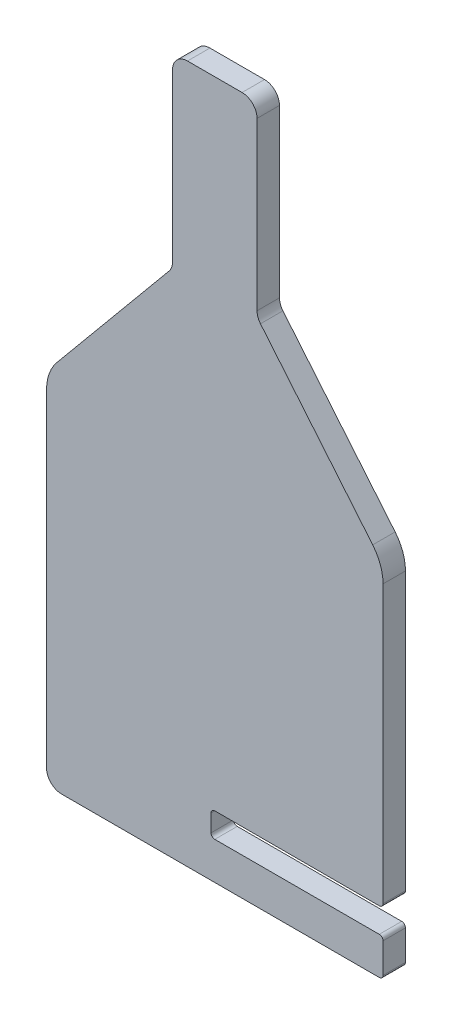
ISO-10303-21;
HEADER;
FILE_DESCRIPTION(('STEP AP214'),'2;1');
FILE_NAME('part.step','',(''),(''),'','','');
FILE_SCHEMA(('AUTOMOTIVE_DESIGN { 1 0 10303 214 1 1 1 1 }'));
ENDSEC;
DATA;
#1=APPLICATION_CONTEXT('core data for automotive mechanical design processes');
#2=APPLICATION_PROTOCOL_DEFINITION('international standard','automotive_design',2000,#1);
#3=PRODUCT_CONTEXT('',#1,'mechanical');
#4=PRODUCT('Part','Part','',(#3));
#5=PRODUCT_RELATED_PRODUCT_CATEGORY('part','',(#4));
#6=PRODUCT_DEFINITION_FORMATION('','',#4);
#7=PRODUCT_DEFINITION_CONTEXT('part definition',#1,'design');
#8=PRODUCT_DEFINITION('design','',#6,#7);
#9=PRODUCT_DEFINITION_SHAPE('','',#8);
#10=(LENGTH_UNIT() NAMED_UNIT(*) SI_UNIT(.MILLI.,.METRE.));
#11=(NAMED_UNIT(*) PLANE_ANGLE_UNIT() SI_UNIT($,.RADIAN.));
#12=(NAMED_UNIT(*) SI_UNIT($,.STERADIAN.) SOLID_ANGLE_UNIT());
#13=UNCERTAINTY_MEASURE_WITH_UNIT(LENGTH_MEASURE(1.E-05),#10,'distance_accuracy_value','');
#14=(GEOMETRIC_REPRESENTATION_CONTEXT(3) GLOBAL_UNCERTAINTY_ASSIGNED_CONTEXT((#13)) GLOBAL_UNIT_ASSIGNED_CONTEXT((#10,
#11,#12)) REPRESENTATION_CONTEXT('',''));
#15=CARTESIAN_POINT('',(0.,0.,0.));
#16=DIRECTION('',(0.,0.,1.));
#17=DIRECTION('',(1.,0.,0.));
#18=AXIS2_PLACEMENT_3D('',#15,#16,#17);
#19=CARTESIAN_POINT('',(22.5,-0.323324039142814,3.));
#20=DIRECTION('',(1.,0.,0.));
#21=DIRECTION('',(0.,1.,0.));
#22=AXIS2_PLACEMENT_3D('',#19,#20,#21);
#23=PLANE('',#22);
#24=DIRECTION('',(0.,-1.,0.));
#25=VECTOR('',#24,1.);
#26=CARTESIAN_POINT('',(22.5,-0.323324039142814,3.));
#27=LINE('',#26,#25);
#28=CARTESIAN_POINT('',(22.5,-2.48720248761186,3.));
#29=VERTEX_POINT('',#28);
#30=CARTESIAN_POINT('',(22.5,-39.5233240391428,3.));
#31=VERTEX_POINT('',#30);
#32=EDGE_CURVE('E376',#29,#31,#27,.T.);
#33=ORIENTED_EDGE('',*,*,#32,.T.);
#34=DIRECTION('',(0.,0.,1.));
#35=VECTOR('',#34,1.);
#36=CARTESIAN_POINT('',(22.5,-39.5233240391428,0.));
#37=LINE('',#36,#35);
#38=CARTESIAN_POINT('',(22.5,-39.5233240391428,0.));
#39=VERTEX_POINT('',#38);
#40=EDGE_CURVE('E325',#31,#39,#37,.F.);
#41=ORIENTED_EDGE('',*,*,#40,.T.);
#42=DIRECTION('',(0.,-1.,0.));
#43=VECTOR('',#42,1.);
#44=CARTESIAN_POINT('',(22.5,-0.323324039142814,0.));
#45=LINE('',#44,#43);
#46=CARTESIAN_POINT('',(22.5,-2.48720248761186,0.));
#47=VERTEX_POINT('',#46);
#48=EDGE_CURVE('E223',#47,#39,#45,.T.);
#49=ORIENTED_EDGE('',*,*,#48,.F.);
#50=DIRECTION('',(0.,0.,-1.));
#51=VECTOR('',#50,1.);
#52=CARTESIAN_POINT('',(22.5,-2.48720248761186,3.));
#53=LINE('',#52,#51);
#54=EDGE_CURVE('E291',#47,#29,#53,.F.);
#55=ORIENTED_EDGE('',*,*,#54,.T.);
#56=EDGE_LOOP('',(#33,#41,#49,#55));
#57=FACE_BOUND('',#56,.T.);
#58=ADVANCED_FACE('F37',(#57),#23,.T.);
#59=CARTESIAN_POINT('',(-5.65,45.,3.));
#60=DIRECTION('',(0.,1.,0.));
#61=DIRECTION('',(0.,0.,1.));
#62=AXIS2_PLACEMENT_3D('',#59,#60,#61);
#63=PLANE('',#62);
#64=DIRECTION('',(1.,0.,0.));
#65=VECTOR('',#64,1.);
#66=CARTESIAN_POINT('',(-5.65,45.,0.));
#67=LINE('',#66,#65);
#68=CARTESIAN_POINT('',(-3.65,45.,0.));
#69=VERTEX_POINT('',#68);
#70=CARTESIAN_POINT('',(3.65,45.,0.));
#71=VERTEX_POINT('',#70);
#72=EDGE_CURVE('E357',#69,#71,#67,.T.);
#73=ORIENTED_EDGE('',*,*,#72,.F.);
#74=DIRECTION('',(0.,0.,-1.));
#75=VECTOR('',#74,1.);
#76=CARTESIAN_POINT('',(-3.65,45.,3.));
#77=LINE('',#76,#75);
#78=CARTESIAN_POINT('',(-3.65,45.,3.));
#79=VERTEX_POINT('',#78);
#80=EDGE_CURVE('E258',#69,#79,#77,.F.);
#81=ORIENTED_EDGE('',*,*,#80,.T.);
#82=DIRECTION('',(1.,0.,0.));
#83=VECTOR('',#82,1.);
#84=CARTESIAN_POINT('',(-5.65,45.,3.));
#85=LINE('',#84,#83);
#86=CARTESIAN_POINT('',(3.65,45.,3.));
#87=VERTEX_POINT('',#86);
#88=EDGE_CURVE('E236',#79,#87,#85,.T.);
#89=ORIENTED_EDGE('',*,*,#88,.T.);
#90=DIRECTION('',(0.,0.,-1.));
#91=VECTOR('',#90,1.);
#92=CARTESIAN_POINT('',(3.65,45.,3.));
#93=LINE('',#92,#91);
#94=EDGE_CURVE('E255',#87,#71,#93,.T.);
#95=ORIENTED_EDGE('',*,*,#94,.T.);
#96=EDGE_LOOP('',(#73,#81,#89,#95));
#97=FACE_BOUND('',#96,.T.);
#98=ADVANCED_FACE('F439',(#97),#63,.T.);
#99=CARTESIAN_POINT('',(-5.65,45.,3.));
#100=DIRECTION('',(1.,0.,0.));
#101=DIRECTION('',(0.,1.,0.));
#102=AXIS2_PLACEMENT_3D('',#99,#100,#101);
#103=PLANE('',#102);
#104=DIRECTION('',(0.,-1.,0.));
#105=VECTOR('',#104,1.);
#106=CARTESIAN_POINT('',(-5.65,45.,0.));
#107=LINE('',#106,#105);
#108=CARTESIAN_POINT('',(-5.65,43.,0.));
#109=VERTEX_POINT('',#108);
#110=CARTESIAN_POINT('',(-5.64999999999999,20.7212671763629,0.));
#111=VERTEX_POINT('',#110);
#112=EDGE_CURVE('E234',#109,#111,#107,.T.);
#113=ORIENTED_EDGE('',*,*,#112,.T.);
#114=DIRECTION('',(0.,0.,-1.));
#115=VECTOR('',#114,1.);
#116=CARTESIAN_POINT('',(-5.64999999999999,20.7212671763629,3.));
#117=LINE('',#116,#115);
#118=CARTESIAN_POINT('',(-5.64999999999999,20.7212671763629,3.));
#119=VERTEX_POINT('',#118);
#120=EDGE_CURVE('E253',#111,#119,#117,.F.);
#121=ORIENTED_EDGE('',*,*,#120,.T.);
#122=DIRECTION('',(0.,-1.,0.));
#123=VECTOR('',#122,1.);
#124=CARTESIAN_POINT('',(-5.65,45.,3.));
#125=LINE('',#124,#123);
#126=CARTESIAN_POINT('',(-5.65,43.,3.));
#127=VERTEX_POINT('',#126);
#128=EDGE_CURVE('E217',#127,#119,#125,.T.);
#129=ORIENTED_EDGE('',*,*,#128,.F.);
#130=DIRECTION('',(0.,0.,-1.));
#131=VECTOR('',#130,1.);
#132=CARTESIAN_POINT('',(-5.65,43.,0.));
#133=LINE('',#132,#131);
#134=EDGE_CURVE('E250',#127,#109,#133,.T.);
#135=ORIENTED_EDGE('',*,*,#134,.T.);
#136=EDGE_LOOP('',(#113,#121,#129,#135));
#137=FACE_BOUND('',#136,.T.);
#138=ADVANCED_FACE('F449',(#137),#103,.F.);
#139=CARTESIAN_POINT('',(-5.64999999999999,20.,3.));
#140=DIRECTION('',(0.769822880270561,-0.638257575757576,0.));
#141=DIRECTION('',(0.638257575757576,0.769822880270561,0.));
#142=AXIS2_PLACEMENT_3D('',#139,#140,#141);
#143=PLANE('',#142);
#144=DIRECTION('',(-0.638257575757576,-0.769822880270561,0.));
#145=VECTOR('',#144,1.);
#146=CARTESIAN_POINT('',(-5.64999999999999,20.,0.));
#147=LINE('',#146,#145);
#148=CARTESIAN_POINT('',(-6.11035423945887,19.4447520248477,0.));
#149=VERTEX_POINT('',#148);
#150=CARTESIAN_POINT('',(-21.1189372816234,1.34241988631403,0.));
#151=VERTEX_POINT('',#150);
#152=EDGE_CURVE('E225',#149,#151,#147,.T.);
#153=ORIENTED_EDGE('',*,*,#152,.T.);
#154=DIRECTION('',(0.,0.,-1.));
#155=VECTOR('',#154,1.);
#156=CARTESIAN_POINT('',(-21.1189372816234,1.34241988631403,3.));
#157=LINE('',#156,#155);
#158=CARTESIAN_POINT('',(-21.1189372816234,1.34241988631403,3.));
#159=VERTEX_POINT('',#158);
#160=EDGE_CURVE('E282',#151,#159,#157,.F.);
#161=ORIENTED_EDGE('',*,*,#160,.T.);
#162=DIRECTION('',(-0.638257575757576,-0.769822880270561,0.));
#163=VECTOR('',#162,1.);
#164=CARTESIAN_POINT('',(-5.64999999999999,20.,3.));
#165=LINE('',#164,#163);
#166=CARTESIAN_POINT('',(-6.11035423945887,19.4447520248477,3.));
#167=VERTEX_POINT('',#166);
#168=EDGE_CURVE('E381',#167,#159,#165,.T.);
#169=ORIENTED_EDGE('',*,*,#168,.F.);
#170=DIRECTION('',(0.,0.,-1.));
#171=VECTOR('',#170,1.);
#172=CARTESIAN_POINT('',(-6.11035423945887,19.4447520248477,0.));
#173=LINE('',#172,#171);
#174=EDGE_CURVE('E247',#167,#149,#173,.T.);
#175=ORIENTED_EDGE('',*,*,#174,.T.);
#176=EDGE_LOOP('',(#153,#161,#169,#175));
#177=FACE_BOUND('',#176,.T.);
#178=ADVANCED_FACE('F458',(#177),#143,.F.);
#179=CARTESIAN_POINT('',(-22.5,-0.323324039142809,3.));
#180=DIRECTION('',(1.,0.,0.));
#181=DIRECTION('',(0.,1.,0.));
#182=AXIS2_PLACEMENT_3D('',#179,#180,#181);
#183=PLANE('',#182);
#184=DIRECTION('',(0.,-1.,0.));
#185=VECTOR('',#184,1.);
#186=CARTESIAN_POINT('',(-22.5,-0.323324039142809,3.));
#187=LINE('',#186,#185);
#188=CARTESIAN_POINT('',(-22.5,-2.48712556823143,3.));
#189=VERTEX_POINT('',#188);
#190=CARTESIAN_POINT('',(-22.5,-46.3233240391428,3.));
#191=VERTEX_POINT('',#190);
#192=EDGE_CURVE('E379',#189,#191,#187,.T.);
#193=ORIENTED_EDGE('',*,*,#192,.F.);
#194=DIRECTION('',(0.,0.,-1.));
#195=VECTOR('',#194,1.);
#196=CARTESIAN_POINT('',(-22.5,-2.48712556823143,3.));
#197=LINE('',#196,#195);
#198=CARTESIAN_POINT('',(-22.5,-2.48712556823143,0.));
#199=VERTEX_POINT('',#198);
#200=EDGE_CURVE('E275',#189,#199,#197,.T.);
#201=ORIENTED_EDGE('',*,*,#200,.T.);
#202=DIRECTION('',(0.,-1.,0.));
#203=VECTOR('',#202,1.);
#204=CARTESIAN_POINT('',(-22.5,-0.323324039142809,0.));
#205=LINE('',#204,#203);
#206=CARTESIAN_POINT('',(-22.5,-46.3233240391428,0.));
#207=VERTEX_POINT('',#206);
#208=EDGE_CURVE('E222',#199,#207,#205,.T.);
#209=ORIENTED_EDGE('',*,*,#208,.T.);
#210=DIRECTION('',(0.,0.,-1.));
#211=VECTOR('',#210,1.);
#212=CARTESIAN_POINT('',(-22.5,-46.3233240391428,3.));
#213=LINE('',#212,#211);
#214=EDGE_CURVE('E207',#207,#191,#213,.F.);
#215=ORIENTED_EDGE('',*,*,#214,.T.);
#216=EDGE_LOOP('',(#193,#201,#209,#215));
#217=FACE_BOUND('',#216,.T.);
#218=ADVANCED_FACE('F466',(#217),#183,.F.);
#219=CARTESIAN_POINT('',(-22.5,-48.3233240391428,3.));
#220=DIRECTION('',(0.,1.,0.));
#221=DIRECTION('',(0.,0.,1.));
#222=AXIS2_PLACEMENT_3D('',#219,#220,#221);
#223=PLANE('',#222);
#224=DIRECTION('',(1.,0.,0.));
#225=VECTOR('',#224,1.);
#226=CARTESIAN_POINT('',(-22.5,-48.3233240391428,0.));
#227=LINE('',#226,#225);
#228=CARTESIAN_POINT('',(-20.5,-48.3233240391428,0.));
#229=VERTEX_POINT('',#228);
#230=CARTESIAN_POINT('',(22.,-48.3233240391428,0.));
#231=VERTEX_POINT('',#230);
#232=EDGE_CURVE('E214',#229,#231,#227,.T.);
#233=ORIENTED_EDGE('',*,*,#232,.T.);
#234=DIRECTION('',(0.,0.,-1.));
#235=VECTOR('',#234,1.);
#236=CARTESIAN_POINT('',(22.,-48.3233240391428,3.));
#237=LINE('',#236,#235);
#238=CARTESIAN_POINT('',(22.,-48.3233240391428,3.));
#239=VERTEX_POINT('',#238);
#240=EDGE_CURVE('E60',#231,#239,#237,.F.);
#241=ORIENTED_EDGE('',*,*,#240,.T.);
#242=DIRECTION('',(1.,0.,0.));
#243=VECTOR('',#242,1.);
#244=CARTESIAN_POINT('',(-22.5,-48.3233240391428,3.));
#245=LINE('',#244,#243);
#246=CARTESIAN_POINT('',(-20.5,-48.3233240391428,3.));
#247=VERTEX_POINT('',#246);
#248=EDGE_CURVE('E215',#247,#239,#245,.T.);
#249=ORIENTED_EDGE('',*,*,#248,.F.);
#250=DIRECTION('',(0.,0.,-1.));
#251=VECTOR('',#250,1.);
#252=CARTESIAN_POINT('',(-20.5,-48.3233240391428,3.));
#253=LINE('',#252,#251);
#254=EDGE_CURVE('E205',#247,#229,#253,.T.);
#255=ORIENTED_EDGE('',*,*,#254,.T.);
#256=EDGE_LOOP('',(#233,#241,#249,#255));
#257=FACE_BOUND('',#256,.T.);
#258=ADVANCED_FACE('F213',(#257),#223,.F.);
#259=CARTESIAN_POINT('',(22.5,-43.8233240391428,3.));
#260=VERTEX_POINT('',#259);
#261=CARTESIAN_POINT('',(22.5,-47.8233240391428,3.));
#262=VERTEX_POINT('',#261);
#263=EDGE_CURVE('E375',#260,#262,#27,.T.);
#264=ORIENTED_EDGE('',*,*,#263,.T.);
#265=DIRECTION('',(0.,0.,-1.));
#266=VECTOR('',#265,1.);
#267=CARTESIAN_POINT('',(22.5,-47.8233240391428,0.));
#268=LINE('',#267,#266);
#269=CARTESIAN_POINT('',(22.5,-47.8233240391428,0.));
#270=VERTEX_POINT('',#269);
#271=EDGE_CURVE('E311',#262,#270,#268,.T.);
#272=ORIENTED_EDGE('',*,*,#271,.T.);
#273=CARTESIAN_POINT('',(22.5,-43.8233240391428,0.));
#274=VERTEX_POINT('',#273);
#275=EDGE_CURVE('E228',#274,#270,#45,.T.);
#276=ORIENTED_EDGE('',*,*,#275,.F.);
#277=DIRECTION('',(0.,0.,1.));
#278=VECTOR('',#277,1.);
#279=CARTESIAN_POINT('',(22.5,-43.8233240391428,3.));
#280=LINE('',#279,#278);
#281=EDGE_CURVE('E308',#274,#260,#280,.T.);
#282=ORIENTED_EDGE('',*,*,#281,.T.);
#283=EDGE_LOOP('',(#264,#272,#276,#282));
#284=FACE_BOUND('',#283,.T.);
#285=ADVANCED_FACE('F394',(#284),#23,.T.);
#286=CARTESIAN_POINT('',(5.65000000000001,19.9990615554433,3.));
#287=DIRECTION('',(0.769808398739628,0.638275041992032,0.));
#288=DIRECTION('',(-0.638275041992032,0.769808398739628,0.));
#289=AXIS2_PLACEMENT_3D('',#286,#287,#288);
#290=PLANE('',#289);
#291=DIRECTION('',(0.638275041992032,-0.769808398739628,0.));
#292=VECTOR('',#291,1.);
#293=CARTESIAN_POINT('',(5.65000000000001,19.9990615554433,3.));
#294=LINE('',#293,#292);
#295=CARTESIAN_POINT('',(6.11038320252075,19.4438042876156,3.));
#296=VERTEX_POINT('',#295);
#297=CARTESIAN_POINT('',(21.1188503924378,1.34244776434033,3.));
#298=VERTEX_POINT('',#297);
#299=EDGE_CURVE('E372',#296,#298,#294,.T.);
#300=ORIENTED_EDGE('',*,*,#299,.T.);
#301=DIRECTION('',(0.,0.,-1.));
#302=VECTOR('',#301,1.);
#303=CARTESIAN_POINT('',(21.1188503924378,1.34244776434033,3.));
#304=LINE('',#303,#302);
#305=CARTESIAN_POINT('',(21.1188503924378,1.34244776434033,0.));
#306=VERTEX_POINT('',#305);
#307=EDGE_CURVE('E288',#298,#306,#304,.T.);
#308=ORIENTED_EDGE('',*,*,#307,.T.);
#309=DIRECTION('',(0.638275041992032,-0.769808398739628,0.));
#310=VECTOR('',#309,1.);
#311=CARTESIAN_POINT('',(5.65000000000001,19.9990615554433,0.));
#312=LINE('',#311,#310);
#313=CARTESIAN_POINT('',(6.11038320252075,19.4438042876156,0.));
#314=VERTEX_POINT('',#313);
#315=EDGE_CURVE('E387',#314,#306,#312,.T.);
#316=ORIENTED_EDGE('',*,*,#315,.F.);
#317=DIRECTION('',(0.,0.,-1.));
#318=VECTOR('',#317,1.);
#319=CARTESIAN_POINT('',(6.11038320252075,19.4438042876156,3.));
#320=LINE('',#319,#318);
#321=EDGE_CURVE('E265',#314,#296,#320,.F.);
#322=ORIENTED_EDGE('',*,*,#321,.T.);
#323=EDGE_LOOP('',(#300,#308,#316,#322));
#324=FACE_BOUND('',#323,.T.);
#325=ADVANCED_FACE('F421',(#324),#290,.T.);
#326=CARTESIAN_POINT('',(5.65,45.,3.));
#327=DIRECTION('',(1.,0.,0.));
#328=DIRECTION('',(0.,1.,0.));
#329=AXIS2_PLACEMENT_3D('',#326,#327,#328);
#330=PLANE('',#329);
#331=DIRECTION('',(0.,-1.,0.));
#332=VECTOR('',#331,1.);
#333=CARTESIAN_POINT('',(5.65,45.,3.));
#334=LINE('',#333,#332);
#335=CARTESIAN_POINT('',(5.65,43.,3.));
#336=VERTEX_POINT('',#335);
#337=CARTESIAN_POINT('',(5.65000000000001,20.7203543715997,3.));
#338=VERTEX_POINT('',#337);
#339=EDGE_CURVE('E369',#336,#338,#334,.T.);
#340=ORIENTED_EDGE('',*,*,#339,.T.);
#341=DIRECTION('',(0.,0.,-1.));
#342=VECTOR('',#341,1.);
#343=CARTESIAN_POINT('',(5.65000000000001,20.7203543715997,0.));
#344=LINE('',#343,#342);
#345=CARTESIAN_POINT('',(5.65000000000001,20.7203543715997,0.));
#346=VERTEX_POINT('',#345);
#347=EDGE_CURVE('E262',#338,#346,#344,.T.);
#348=ORIENTED_EDGE('',*,*,#347,.T.);
#349=DIRECTION('',(0.,-1.,0.));
#350=VECTOR('',#349,1.);
#351=CARTESIAN_POINT('',(5.65,45.,0.));
#352=LINE('',#351,#350);
#353=CARTESIAN_POINT('',(5.65,43.,0.));
#354=VERTEX_POINT('',#353);
#355=EDGE_CURVE('E360',#354,#346,#352,.T.);
#356=ORIENTED_EDGE('',*,*,#355,.F.);
#357=DIRECTION('',(0.,0.,-1.));
#358=VECTOR('',#357,1.);
#359=CARTESIAN_POINT('',(5.65,43.,3.));
#360=LINE('',#359,#358);
#361=EDGE_CURVE('E260',#354,#336,#360,.F.);
#362=ORIENTED_EDGE('',*,*,#361,.T.);
#363=EDGE_LOOP('',(#340,#348,#356,#362));
#364=FACE_BOUND('',#363,.T.);
#365=ADVANCED_FACE('F431',(#364),#330,.T.);
#366=CARTESIAN_POINT('',(0.,0.,3.));
#367=DIRECTION('',(0.,0.,-1.));
#368=DIRECTION('',(-1.,0.,0.));
#369=AXIS2_PLACEMENT_3D('',#366,#367,#368);
#370=PLANE('',#369);
#371=ORIENTED_EDGE('',*,*,#248,.T.);
#372=CARTESIAN_POINT('',(22.,-47.8233240391428,3.));
#373=DIRECTION('',(0.,0.,-1.));
#374=DIRECTION('',(-1.,0.,0.));
#375=AXIS2_PLACEMENT_3D('',#372,#373,#374);
#376=CIRCLE('',#375,0.5);
#377=EDGE_CURVE('E323',#239,#262,#376,.F.);
#378=ORIENTED_EDGE('',*,*,#377,.T.);
#379=ORIENTED_EDGE('',*,*,#263,.F.);
#380=CARTESIAN_POINT('',(22.,-43.8233240391428,3.));
#381=DIRECTION('',(0.,0.,-1.));
#382=DIRECTION('',(-1.,0.,0.));
#383=AXIS2_PLACEMENT_3D('',#380,#381,#382);
#384=CIRCLE('',#383,0.5);
#385=CARTESIAN_POINT('',(22.,-43.3233240391428,3.));
#386=VERTEX_POINT('',#385);
#387=EDGE_CURVE('E321',#260,#386,#384,.F.);
#388=ORIENTED_EDGE('',*,*,#387,.T.);
#389=DIRECTION('',(1.,0.,0.));
#390=VECTOR('',#389,1.);
#391=CARTESIAN_POINT('',(22.5,-43.3233240391428,3.));
#392=LINE('',#391,#390);
#393=CARTESIAN_POINT('',(0.,-43.3233240391428,3.));
#394=VERTEX_POINT('',#393);
#395=EDGE_CURVE('E336',#394,#386,#392,.T.);
#396=ORIENTED_EDGE('',*,*,#395,.F.);
#397=CARTESIAN_POINT('',(0.,-42.8233240391428,3.));
#398=DIRECTION('',(0.,0.,-1.));
#399=DIRECTION('',(-1.,0.,0.));
#400=AXIS2_PLACEMENT_3D('',#397,#398,#399);
#401=CIRCLE('',#400,0.5);
#402=CARTESIAN_POINT('',(-0.500000000000001,-42.8233240391428,3.));
#403=VERTEX_POINT('',#402);
#404=EDGE_CURVE('E45',#394,#403,#401,.T.);
#405=ORIENTED_EDGE('',*,*,#404,.T.);
#406=DIRECTION('',(0.,-1.,0.));
#407=VECTOR('',#406,1.);
#408=CARTESIAN_POINT('',(-0.500000000000001,-40.0233240391428,3.));
#409=LINE('',#408,#407);
#410=CARTESIAN_POINT('',(-0.500000000000001,-40.5233240391428,3.));
#411=VERTEX_POINT('',#410);
#412=EDGE_CURVE('E334',#411,#403,#409,.T.);
#413=ORIENTED_EDGE('',*,*,#412,.F.);
#414=CARTESIAN_POINT('',(0.,-40.5233240391428,3.));
#415=DIRECTION('',(0.,0.,-1.));
#416=DIRECTION('',(-1.,0.,0.));
#417=AXIS2_PLACEMENT_3D('',#414,#415,#416);
#418=CIRCLE('',#417,0.5);
#419=CARTESIAN_POINT('',(0.,-40.0233240391428,3.));
#420=VERTEX_POINT('',#419);
#421=EDGE_CURVE('E327',#411,#420,#418,.T.);
#422=ORIENTED_EDGE('',*,*,#421,.T.);
#423=DIRECTION('',(-1.,0.,0.));
#424=VECTOR('',#423,1.);
#425=CARTESIAN_POINT('',(22.5,-40.0233240391428,3.));
#426=LINE('',#425,#424);
#427=CARTESIAN_POINT('',(22.,-40.0233240391428,3.));
#428=VERTEX_POINT('',#427);
#429=EDGE_CURVE('E345',#428,#420,#426,.T.);
#430=ORIENTED_EDGE('',*,*,#429,.F.);
#431=CARTESIAN_POINT('',(22.,-39.5233240391428,3.));
#432=DIRECTION('',(0.,0.,-1.));
#433=DIRECTION('',(-1.,0.,0.));
#434=AXIS2_PLACEMENT_3D('',#431,#432,#433);
#435=CIRCLE('',#434,0.5);
#436=EDGE_CURVE('E52',#428,#31,#435,.F.);
#437=ORIENTED_EDGE('',*,*,#436,.T.);
#438=ORIENTED_EDGE('',*,*,#32,.F.);
#439=CARTESIAN_POINT('',(16.5,-2.48720248761186,3.));
#440=DIRECTION('',(0.,0.,-1.));
#441=DIRECTION('',(-1.,0.,0.));
#442=AXIS2_PLACEMENT_3D('',#439,#440,#441);
#443=CIRCLE('',#442,6.);
#444=EDGE_CURVE('E284',#29,#298,#443,.F.);
#445=ORIENTED_EDGE('',*,*,#444,.T.);
#446=ORIENTED_EDGE('',*,*,#299,.F.);
#447=CARTESIAN_POINT('',(7.65000000000001,20.7203543715997,3.));
#448=DIRECTION('',(0.,0.,-1.));
#449=DIRECTION('',(-1.,0.,0.));
#450=AXIS2_PLACEMENT_3D('',#447,#448,#449);
#451=CIRCLE('',#450,2.);
#452=EDGE_CURVE('E273',#296,#338,#451,.T.);
#453=ORIENTED_EDGE('',*,*,#452,.T.);
#454=ORIENTED_EDGE('',*,*,#339,.F.);
#455=CARTESIAN_POINT('',(3.65,43.,3.));
#456=DIRECTION('',(0.,0.,-1.));
#457=DIRECTION('',(-1.,0.,0.));
#458=AXIS2_PLACEMENT_3D('',#455,#456,#457);
#459=CIRCLE('',#458,2.);
#460=EDGE_CURVE('E241',#336,#87,#459,.F.);
#461=ORIENTED_EDGE('',*,*,#460,.T.);
#462=ORIENTED_EDGE('',*,*,#88,.F.);
#463=CARTESIAN_POINT('',(-3.65,43.,3.));
#464=DIRECTION('',(0.,0.,-1.));
#465=DIRECTION('',(-1.,0.,0.));
#466=AXIS2_PLACEMENT_3D('',#463,#464,#465);
#467=CIRCLE('',#466,2.);
#468=EDGE_CURVE('E243',#79,#127,#467,.F.);
#469=ORIENTED_EDGE('',*,*,#468,.T.);
#470=ORIENTED_EDGE('',*,*,#128,.T.);
#471=CARTESIAN_POINT('',(-7.64999999999999,20.7212671763629,3.));
#472=DIRECTION('',(0.,0.,-1.));
#473=DIRECTION('',(-1.,0.,0.));
#474=AXIS2_PLACEMENT_3D('',#471,#472,#473);
#475=CIRCLE('',#474,2.);
#476=EDGE_CURVE('E269',#119,#167,#475,.T.);
#477=ORIENTED_EDGE('',*,*,#476,.T.);
#478=ORIENTED_EDGE('',*,*,#168,.T.);
#479=CARTESIAN_POINT('',(-16.5,-2.48712556823143,3.));
#480=DIRECTION('',(0.,0.,-1.));
#481=DIRECTION('',(-1.,0.,0.));
#482=AXIS2_PLACEMENT_3D('',#479,#480,#481);
#483=CIRCLE('',#482,6.);
#484=EDGE_CURVE('E286',#159,#189,#483,.F.);
#485=ORIENTED_EDGE('',*,*,#484,.T.);
#486=ORIENTED_EDGE('',*,*,#192,.T.);
#487=CARTESIAN_POINT('',(-20.5,-46.3233240391428,3.));
#488=DIRECTION('',(0.,0.,-1.));
#489=DIRECTION('',(-1.,0.,0.));
#490=AXIS2_PLACEMENT_3D('',#487,#488,#489);
#491=CIRCLE('',#490,2.);
#492=EDGE_CURVE('E245',#191,#247,#491,.F.);
#493=ORIENTED_EDGE('',*,*,#492,.T.);
#494=EDGE_LOOP('',(#371,#378,#379,#388,#396,#405,#413,#422,#430,#437,#438,#445,#446,#453,#454,
#461,#462,#469,#470,#477,#478,#485,#486,#493));
#495=FACE_BOUND('',#494,.T.);
#496=ADVANCED_FACE('F333',(#495),#370,.F.);
#497=CARTESIAN_POINT('',(0.,0.,0.));
#498=DIRECTION('',(0.,0.,-1.));
#499=DIRECTION('',(-1.,0.,0.));
#500=AXIS2_PLACEMENT_3D('',#497,#498,#499);
#501=PLANE('',#500);
#502=ORIENTED_EDGE('',*,*,#275,.T.);
#503=CARTESIAN_POINT('',(22.,-47.8233240391428,0.));
#504=DIRECTION('',(0.,0.,-1.));
#505=DIRECTION('',(-1.,0.,0.));
#506=AXIS2_PLACEMENT_3D('',#503,#504,#505);
#507=CIRCLE('',#506,0.5);
#508=EDGE_CURVE('E221',#270,#231,#507,.T.);
#509=ORIENTED_EDGE('',*,*,#508,.T.);
#510=ORIENTED_EDGE('',*,*,#232,.F.);
#511=CARTESIAN_POINT('',(-20.5,-46.3233240391428,0.));
#512=DIRECTION('',(0.,0.,-1.));
#513=DIRECTION('',(-1.,0.,0.));
#514=AXIS2_PLACEMENT_3D('',#511,#512,#513);
#515=CIRCLE('',#514,2.);
#516=EDGE_CURVE('E201',#229,#207,#515,.T.);
#517=ORIENTED_EDGE('',*,*,#516,.T.);
#518=ORIENTED_EDGE('',*,*,#208,.F.);
#519=CARTESIAN_POINT('',(-16.5,-2.48712556823143,0.));
#520=DIRECTION('',(0.,0.,-1.));
#521=DIRECTION('',(-1.,0.,0.));
#522=AXIS2_PLACEMENT_3D('',#519,#520,#521);
#523=CIRCLE('',#522,6.);
#524=EDGE_CURVE('E280',#199,#151,#523,.T.);
#525=ORIENTED_EDGE('',*,*,#524,.T.);
#526=ORIENTED_EDGE('',*,*,#152,.F.);
#527=CARTESIAN_POINT('',(-7.64999999999999,20.7212671763629,0.));
#528=DIRECTION('',(0.,0.,-1.));
#529=DIRECTION('',(-1.,0.,0.));
#530=AXIS2_PLACEMENT_3D('',#527,#528,#529);
#531=CIRCLE('',#530,2.);
#532=EDGE_CURVE('E267',#149,#111,#531,.F.);
#533=ORIENTED_EDGE('',*,*,#532,.T.);
#534=ORIENTED_EDGE('',*,*,#112,.F.);
#535=CARTESIAN_POINT('',(-3.65,43.,0.));
#536=DIRECTION('',(0.,0.,-1.));
#537=DIRECTION('',(-1.,0.,0.));
#538=AXIS2_PLACEMENT_3D('',#535,#536,#537);
#539=CIRCLE('',#538,2.);
#540=EDGE_CURVE('E211',#109,#69,#539,.T.);
#541=ORIENTED_EDGE('',*,*,#540,.T.);
#542=ORIENTED_EDGE('',*,*,#72,.T.);
#543=CARTESIAN_POINT('',(3.65,43.,0.));
#544=DIRECTION('',(0.,0.,-1.));
#545=DIRECTION('',(-1.,0.,0.));
#546=AXIS2_PLACEMENT_3D('',#543,#544,#545);
#547=CIRCLE('',#546,2.);
#548=EDGE_CURVE('E216',#71,#354,#547,.T.);
#549=ORIENTED_EDGE('',*,*,#548,.T.);
#550=ORIENTED_EDGE('',*,*,#355,.T.);
#551=CARTESIAN_POINT('',(7.65000000000001,20.7203543715997,0.));
#552=DIRECTION('',(0.,0.,-1.));
#553=DIRECTION('',(-1.,0.,0.));
#554=AXIS2_PLACEMENT_3D('',#551,#552,#553);
#555=CIRCLE('',#554,2.);
#556=EDGE_CURVE('E271',#346,#314,#555,.F.);
#557=ORIENTED_EDGE('',*,*,#556,.T.);
#558=ORIENTED_EDGE('',*,*,#315,.T.);
#559=CARTESIAN_POINT('',(16.5,-2.48720248761186,0.));
#560=DIRECTION('',(0.,0.,-1.));
#561=DIRECTION('',(-1.,0.,0.));
#562=AXIS2_PLACEMENT_3D('',#559,#560,#561);
#563=CIRCLE('',#562,6.);
#564=EDGE_CURVE('E278',#306,#47,#563,.T.);
#565=ORIENTED_EDGE('',*,*,#564,.T.);
#566=ORIENTED_EDGE('',*,*,#48,.T.);
#567=CARTESIAN_POINT('',(22.,-39.5233240391428,0.));
#568=DIRECTION('',(0.,0.,-1.));
#569=DIRECTION('',(-1.,0.,0.));
#570=AXIS2_PLACEMENT_3D('',#567,#568,#569);
#571=CIRCLE('',#570,0.5);
#572=CARTESIAN_POINT('',(22.,-40.0233240391428,0.));
#573=VERTEX_POINT('',#572);
#574=EDGE_CURVE('E314',#39,#573,#571,.T.);
#575=ORIENTED_EDGE('',*,*,#574,.T.);
#576=DIRECTION('',(-1.,0.,0.));
#577=VECTOR('',#576,1.);
#578=CARTESIAN_POINT('',(22.5,-40.0233240391428,0.));
#579=LINE('',#578,#577);
#580=CARTESIAN_POINT('',(0.,-40.0233240391428,0.));
#581=VERTEX_POINT('',#580);
#582=EDGE_CURVE('E362',#573,#581,#579,.T.);
#583=ORIENTED_EDGE('',*,*,#582,.T.);
#584=CARTESIAN_POINT('',(0.,-40.5233240391428,0.));
#585=DIRECTION('',(0.,0.,-1.));
#586=DIRECTION('',(-1.,0.,0.));
#587=AXIS2_PLACEMENT_3D('',#584,#585,#586);
#588=CIRCLE('',#587,0.5);
#589=CARTESIAN_POINT('',(-0.500000000000001,-40.5233240391428,0.));
#590=VERTEX_POINT('',#589);
#591=EDGE_CURVE('E329',#581,#590,#588,.F.);
#592=ORIENTED_EDGE('',*,*,#591,.T.);
#593=DIRECTION('',(0.,-1.,0.));
#594=VECTOR('',#593,1.);
#595=CARTESIAN_POINT('',(-0.500000000000001,-40.0233240391428,0.));
#596=LINE('',#595,#594);
#597=CARTESIAN_POINT('',(-0.500000000000001,-42.8233240391428,0.));
#598=VERTEX_POINT('',#597);
#599=EDGE_CURVE('E353',#590,#598,#596,.T.);
#600=ORIENTED_EDGE('',*,*,#599,.T.);
#601=CARTESIAN_POINT('',(0.,-42.8233240391428,0.));
#602=DIRECTION('',(0.,0.,-1.));
#603=DIRECTION('',(-1.,0.,0.));
#604=AXIS2_PLACEMENT_3D('',#601,#602,#603);
#605=CIRCLE('',#604,0.5);
#606=CARTESIAN_POINT('',(0.,-43.3233240391428,0.));
#607=VERTEX_POINT('',#606);
#608=EDGE_CURVE('E11',#598,#607,#605,.F.);
#609=ORIENTED_EDGE('',*,*,#608,.T.);
#610=DIRECTION('',(1.,0.,0.));
#611=VECTOR('',#610,1.);
#612=CARTESIAN_POINT('',(22.5,-43.3233240391428,0.));
#613=LINE('',#612,#611);
#614=CARTESIAN_POINT('',(22.,-43.3233240391428,0.));
#615=VERTEX_POINT('',#614);
#616=EDGE_CURVE('E351',#607,#615,#613,.T.);
#617=ORIENTED_EDGE('',*,*,#616,.T.);
#618=CARTESIAN_POINT('',(22.,-43.8233240391428,0.));
#619=DIRECTION('',(0.,0.,-1.));
#620=DIRECTION('',(-1.,0.,0.));
#621=AXIS2_PLACEMENT_3D('',#618,#619,#620);
#622=CIRCLE('',#621,0.5);
#623=EDGE_CURVE('E316',#615,#274,#622,.T.);
#624=ORIENTED_EDGE('',*,*,#623,.T.);
#625=EDGE_LOOP('',(#502,#509,#510,#517,#518,#525,#526,#533,#534,#541,#542,#549,#550,#557,#558,
#565,#566,#575,#583,#592,#600,#609,#617,#624));
#626=FACE_BOUND('',#625,.T.);
#627=ADVANCED_FACE('F220',(#626),#501,.T.);
#628=CARTESIAN_POINT('',(22.5,-40.0233240391428,-23.2355331335435));
#629=DIRECTION('',(0.,1.,0.));
#630=DIRECTION('',(0.,0.,1.));
#631=AXIS2_PLACEMENT_3D('',#628,#629,#630);
#632=PLANE('',#631);
#633=ORIENTED_EDGE('',*,*,#429,.T.);
#634=DIRECTION('',(0.,0.,1.));
#635=VECTOR('',#634,1.);
#636=CARTESIAN_POINT('',(0.,-40.0233240391428,0.));
#637=LINE('',#636,#635);
#638=EDGE_CURVE('E301',#420,#581,#637,.F.);
#639=ORIENTED_EDGE('',*,*,#638,.T.);
#640=ORIENTED_EDGE('',*,*,#582,.F.);
#641=DIRECTION('',(0.,0.,1.));
#642=VECTOR('',#641,1.);
#643=CARTESIAN_POINT('',(22.,-40.0233240391428,3.));
#644=LINE('',#643,#642);
#645=EDGE_CURVE('E298',#573,#428,#644,.T.);
#646=ORIENTED_EDGE('',*,*,#645,.T.);
#647=EDGE_LOOP('',(#633,#639,#640,#646));
#648=FACE_BOUND('',#647,.T.);
#649=ADVANCED_FACE('F404',(#648),#632,.F.);
#650=CARTESIAN_POINT('',(-0.500000000000001,-40.0233240391428,-23.2355331335435));
#651=DIRECTION('',(-1.,0.,0.));
#652=DIRECTION('',(0.,-1.,0.));
#653=AXIS2_PLACEMENT_3D('',#650,#651,#652);
#654=PLANE('',#653);
#655=ORIENTED_EDGE('',*,*,#599,.F.);
#656=DIRECTION('',(0.,0.,1.));
#657=VECTOR('',#656,1.);
#658=CARTESIAN_POINT('',(-0.500000000000001,-40.5233240391428,3.));
#659=LINE('',#658,#657);
#660=EDGE_CURVE('E295',#590,#411,#659,.T.);
#661=ORIENTED_EDGE('',*,*,#660,.T.);
#662=ORIENTED_EDGE('',*,*,#412,.T.);
#663=DIRECTION('',(0.,0.,1.));
#664=VECTOR('',#663,1.);
#665=CARTESIAN_POINT('',(-0.500000000000001,-42.8233240391428,0.));
#666=LINE('',#665,#664);
#667=EDGE_CURVE('E293',#403,#598,#666,.F.);
#668=ORIENTED_EDGE('',*,*,#667,.T.);
#669=EDGE_LOOP('',(#655,#661,#662,#668));
#670=FACE_BOUND('',#669,.T.);
#671=ADVANCED_FACE('F342',(#670),#654,.F.);
#672=CARTESIAN_POINT('',(22.5,-43.3233240391428,-23.2355331335435));
#673=DIRECTION('',(0.,-1.,0.));
#674=DIRECTION('',(0.,0.,-1.));
#675=AXIS2_PLACEMENT_3D('',#672,#673,#674);
#676=PLANE('',#675);
#677=ORIENTED_EDGE('',*,*,#616,.F.);
#678=DIRECTION('',(0.,0.,1.));
#679=VECTOR('',#678,1.);
#680=CARTESIAN_POINT('',(0.,-43.3233240391428,3.));
#681=LINE('',#680,#679);
#682=EDGE_CURVE('E305',#607,#394,#681,.T.);
#683=ORIENTED_EDGE('',*,*,#682,.T.);
#684=ORIENTED_EDGE('',*,*,#395,.T.);
#685=DIRECTION('',(0.,0.,1.));
#686=VECTOR('',#685,1.);
#687=CARTESIAN_POINT('',(22.,-43.3233240391428,0.));
#688=LINE('',#687,#686);
#689=EDGE_CURVE('E303',#386,#615,#688,.F.);
#690=ORIENTED_EDGE('',*,*,#689,.T.);
#691=EDGE_LOOP('',(#677,#683,#684,#690));
#692=FACE_BOUND('',#691,.T.);
#693=ADVANCED_FACE('F355',(#692),#676,.F.);
#694=CARTESIAN_POINT('',(-20.5,-46.3233240391428,3.));
#695=DIRECTION('',(0.,0.,-1.));
#696=DIRECTION('',(-1.,0.,0.));
#697=AXIS2_PLACEMENT_3D('',#694,#695,#696);
#698=CYLINDRICAL_SURFACE('',#697,2.);
#699=ORIENTED_EDGE('',*,*,#492,.F.);
#700=ORIENTED_EDGE('',*,*,#214,.F.);
#701=ORIENTED_EDGE('',*,*,#516,.F.);
#702=ORIENTED_EDGE('',*,*,#254,.F.);
#703=EDGE_LOOP('',(#699,#700,#701,#702));
#704=FACE_BOUND('',#703,.T.);
#705=ADVANCED_FACE('F204',(#704),#698,.T.);
#706=CARTESIAN_POINT('',(-7.64999999999999,20.7212671763629,3.));
#707=DIRECTION('',(0.,0.,1.));
#708=DIRECTION('',(1.,0.,0.));
#709=AXIS2_PLACEMENT_3D('',#706,#707,#708);
#710=CYLINDRICAL_SURFACE('',#709,2.);
#711=ORIENTED_EDGE('',*,*,#476,.F.);
#712=ORIENTED_EDGE('',*,*,#120,.F.);
#713=ORIENTED_EDGE('',*,*,#532,.F.);
#714=ORIENTED_EDGE('',*,*,#174,.F.);
#715=EDGE_LOOP('',(#711,#712,#713,#714));
#716=FACE_BOUND('',#715,.T.);
#717=ADVANCED_FACE('F455',(#716),#710,.F.);
#718=CARTESIAN_POINT('',(-3.65,43.,3.));
#719=DIRECTION('',(0.,0.,1.));
#720=DIRECTION('',(1.,0.,0.));
#721=AXIS2_PLACEMENT_3D('',#718,#719,#720);
#722=CYLINDRICAL_SURFACE('',#721,2.);
#723=ORIENTED_EDGE('',*,*,#468,.F.);
#724=ORIENTED_EDGE('',*,*,#80,.F.);
#725=ORIENTED_EDGE('',*,*,#540,.F.);
#726=ORIENTED_EDGE('',*,*,#134,.F.);
#727=EDGE_LOOP('',(#723,#724,#725,#726));
#728=FACE_BOUND('',#727,.T.);
#729=ADVANCED_FACE('F446',(#728),#722,.T.);
#730=CARTESIAN_POINT('',(7.65000000000001,20.7203543715997,3.));
#731=DIRECTION('',(0.,0.,1.));
#732=DIRECTION('',(1.,0.,0.));
#733=AXIS2_PLACEMENT_3D('',#730,#731,#732);
#734=CYLINDRICAL_SURFACE('',#733,2.);
#735=ORIENTED_EDGE('',*,*,#452,.F.);
#736=ORIENTED_EDGE('',*,*,#321,.F.);
#737=ORIENTED_EDGE('',*,*,#556,.F.);
#738=ORIENTED_EDGE('',*,*,#347,.F.);
#739=EDGE_LOOP('',(#735,#736,#737,#738));
#740=FACE_BOUND('',#739,.T.);
#741=ADVANCED_FACE('F428',(#740),#734,.F.);
#742=CARTESIAN_POINT('',(3.65,43.,3.));
#743=DIRECTION('',(0.,0.,-1.));
#744=DIRECTION('',(-1.,0.,0.));
#745=AXIS2_PLACEMENT_3D('',#742,#743,#744);
#746=CYLINDRICAL_SURFACE('',#745,2.);
#747=ORIENTED_EDGE('',*,*,#460,.F.);
#748=ORIENTED_EDGE('',*,*,#361,.F.);
#749=ORIENTED_EDGE('',*,*,#548,.F.);
#750=ORIENTED_EDGE('',*,*,#94,.F.);
#751=EDGE_LOOP('',(#747,#748,#749,#750));
#752=FACE_BOUND('',#751,.T.);
#753=ADVANCED_FACE('F437',(#752),#746,.T.);
#754=CARTESIAN_POINT('',(-16.5,-2.48712556823143,3.));
#755=DIRECTION('',(0.,0.,-1.));
#756=DIRECTION('',(-1.,0.,0.));
#757=AXIS2_PLACEMENT_3D('',#754,#755,#756);
#758=CYLINDRICAL_SURFACE('',#757,6.);
#759=ORIENTED_EDGE('',*,*,#484,.F.);
#760=ORIENTED_EDGE('',*,*,#160,.F.);
#761=ORIENTED_EDGE('',*,*,#524,.F.);
#762=ORIENTED_EDGE('',*,*,#200,.F.);
#763=EDGE_LOOP('',(#759,#760,#761,#762));
#764=FACE_BOUND('',#763,.T.);
#765=ADVANCED_FACE('F464',(#764),#758,.T.);
#766=CARTESIAN_POINT('',(16.5,-2.48720248761186,3.));
#767=DIRECTION('',(0.,0.,-1.));
#768=DIRECTION('',(-1.,0.,0.));
#769=AXIS2_PLACEMENT_3D('',#766,#767,#768);
#770=CYLINDRICAL_SURFACE('',#769,6.);
#771=ORIENTED_EDGE('',*,*,#444,.F.);
#772=ORIENTED_EDGE('',*,*,#54,.F.);
#773=ORIENTED_EDGE('',*,*,#564,.F.);
#774=ORIENTED_EDGE('',*,*,#307,.F.);
#775=EDGE_LOOP('',(#771,#772,#773,#774));
#776=FACE_BOUND('',#775,.T.);
#777=ADVANCED_FACE('F419',(#776),#770,.T.);
#778=CARTESIAN_POINT('',(0.,-40.5233240391428,-23.2355331335435));
#779=DIRECTION('',(0.,0.,-1.));
#780=DIRECTION('',(-1.,0.,0.));
#781=AXIS2_PLACEMENT_3D('',#778,#779,#780);
#782=CYLINDRICAL_SURFACE('',#781,0.5);
#783=ORIENTED_EDGE('',*,*,#591,.F.);
#784=ORIENTED_EDGE('',*,*,#638,.F.);
#785=ORIENTED_EDGE('',*,*,#421,.F.);
#786=ORIENTED_EDGE('',*,*,#660,.F.);
#787=EDGE_LOOP('',(#783,#784,#785,#786));
#788=FACE_BOUND('',#787,.T.);
#789=ADVANCED_FACE('F409',(#788),#782,.F.);
#790=CARTESIAN_POINT('',(0.,-42.8233240391428,-23.2355331335435));
#791=DIRECTION('',(0.,0.,-1.));
#792=DIRECTION('',(-1.,0.,0.));
#793=AXIS2_PLACEMENT_3D('',#790,#791,#792);
#794=CYLINDRICAL_SURFACE('',#793,0.5);
#795=ORIENTED_EDGE('',*,*,#608,.F.);
#796=ORIENTED_EDGE('',*,*,#667,.F.);
#797=ORIENTED_EDGE('',*,*,#404,.F.);
#798=ORIENTED_EDGE('',*,*,#682,.F.);
#799=EDGE_LOOP('',(#795,#796,#797,#798));
#800=FACE_BOUND('',#799,.T.);
#801=ADVANCED_FACE('F348',(#800),#794,.F.);
#802=CARTESIAN_POINT('',(22.,-47.8233240391428,3.));
#803=DIRECTION('',(0.,0.,1.));
#804=DIRECTION('',(1.,0.,0.));
#805=AXIS2_PLACEMENT_3D('',#802,#803,#804);
#806=CYLINDRICAL_SURFACE('',#805,0.5);
#807=ORIENTED_EDGE('',*,*,#377,.F.);
#808=ORIENTED_EDGE('',*,*,#240,.F.);
#809=ORIENTED_EDGE('',*,*,#508,.F.);
#810=ORIENTED_EDGE('',*,*,#271,.F.);
#811=EDGE_LOOP('',(#807,#808,#809,#810));
#812=FACE_BOUND('',#811,.T.);
#813=ADVANCED_FACE('F469',(#812),#806,.T.);
#814=CARTESIAN_POINT('',(22.,-43.8233240391428,3.));
#815=DIRECTION('',(0.,0.,-1.));
#816=DIRECTION('',(-1.,0.,0.));
#817=AXIS2_PLACEMENT_3D('',#814,#815,#816);
#818=CYLINDRICAL_SURFACE('',#817,0.5);
#819=ORIENTED_EDGE('',*,*,#623,.F.);
#820=ORIENTED_EDGE('',*,*,#689,.F.);
#821=ORIENTED_EDGE('',*,*,#387,.F.);
#822=ORIENTED_EDGE('',*,*,#281,.F.);
#823=EDGE_LOOP('',(#819,#820,#821,#822));
#824=FACE_BOUND('',#823,.T.);
#825=ADVANCED_FACE('F398',(#824),#818,.T.);
#826=CARTESIAN_POINT('',(22.,-39.5233240391428,-23.2355331335435));
#827=DIRECTION('',(0.,0.,-1.));
#828=DIRECTION('',(-1.,0.,0.));
#829=AXIS2_PLACEMENT_3D('',#826,#827,#828);
#830=CYLINDRICAL_SURFACE('',#829,0.5);
#831=ORIENTED_EDGE('',*,*,#574,.F.);
#832=ORIENTED_EDGE('',*,*,#40,.F.);
#833=ORIENTED_EDGE('',*,*,#436,.F.);
#834=ORIENTED_EDGE('',*,*,#645,.F.);
#835=EDGE_LOOP('',(#831,#832,#833,#834));
#836=FACE_BOUND('',#835,.T.);
#837=ADVANCED_FACE('F39',(#836),#830,.T.);
#838=CLOSED_SHELL('',(#58,#98,#138,#178,#218,#258,#285,#325,#365,#496,#627,#649,#671,#693,#705,
#717,#729,#741,#753,#765,#777,#789,#801,#813,#825,#837));
#839=MANIFOLD_SOLID_BREP('B2',#838);
#840=ADVANCED_BREP_SHAPE_REPRESENTATION('',(#18,#839),#14);
#841=SHAPE_DEFINITION_REPRESENTATION(#9,#840);
ENDSEC;
END-ISO-10303-21;
